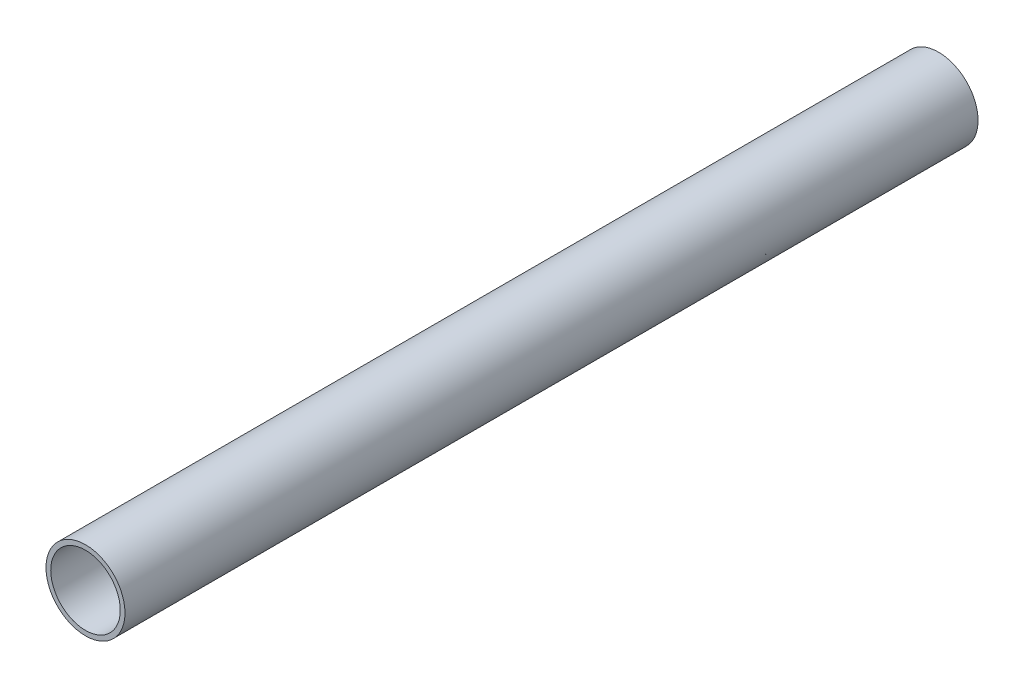
ISO-10303-21;
HEADER;
FILE_DESCRIPTION(('STEP AP214'),'2;1');
FILE_NAME('part.step','',(''),(''),'','','');
FILE_SCHEMA(('AUTOMOTIVE_DESIGN { 1 0 10303 214 1 1 1 1 }'));
ENDSEC;
DATA;
#1=APPLICATION_CONTEXT('core data for automotive mechanical design processes');
#2=APPLICATION_PROTOCOL_DEFINITION('international standard','automotive_design',2000,#1);
#3=PRODUCT_CONTEXT('',#1,'mechanical');
#4=PRODUCT('Part','Part','',(#3));
#5=PRODUCT_RELATED_PRODUCT_CATEGORY('part','',(#4));
#6=PRODUCT_DEFINITION_FORMATION('','',#4);
#7=PRODUCT_DEFINITION_CONTEXT('part definition',#1,'design');
#8=PRODUCT_DEFINITION('design','',#6,#7);
#9=PRODUCT_DEFINITION_SHAPE('','',#8);
#10=(LENGTH_UNIT() NAMED_UNIT(*) SI_UNIT(.MILLI.,.METRE.));
#11=(NAMED_UNIT(*) PLANE_ANGLE_UNIT() SI_UNIT($,.RADIAN.));
#12=(NAMED_UNIT(*) SI_UNIT($,.STERADIAN.) SOLID_ANGLE_UNIT());
#13=UNCERTAINTY_MEASURE_WITH_UNIT(LENGTH_MEASURE(1.E-05),#10,'distance_accuracy_value','');
#14=(GEOMETRIC_REPRESENTATION_CONTEXT(3) GLOBAL_UNCERTAINTY_ASSIGNED_CONTEXT((#13)) GLOBAL_UNIT_ASSIGNED_CONTEXT((#10,
#11,#12)) REPRESENTATION_CONTEXT('',''));
#15=CARTESIAN_POINT('',(0.,0.,0.));
#16=DIRECTION('',(0.,0.,1.));
#17=DIRECTION('',(1.,0.,0.));
#18=AXIS2_PLACEMENT_3D('',#15,#16,#17);
#19=CARTESIAN_POINT('',(0.,0.,235.43));
#20=DIRECTION('',(0.,0.,-1.));
#21=DIRECTION('',(-1.,0.,0.));
#22=AXIS2_PLACEMENT_3D('',#19,#20,#21);
#23=CYLINDRICAL_SURFACE('',#22,12.5);
#24=CARTESIAN_POINT('',(0.,0.,-19.57));
#25=DIRECTION('',(0.,0.,-1.));
#26=DIRECTION('',(-1.,0.,0.));
#27=AXIS2_PLACEMENT_3D('',#24,#25,#26);
#28=CIRCLE('',#27,12.5);
#29=CARTESIAN_POINT('',(-12.5,0.,-19.57));
#30=VERTEX_POINT('',#29);
#31=EDGE_CURVE('E10',#30,#30,#28,.T.);
#32=ORIENTED_EDGE('',*,*,#31,.F.);
#33=EDGE_LOOP('',(#32));
#34=FACE_BOUND('',#33,.T.);
#35=CARTESIAN_POINT('',(0.,0.,250.43));
#36=DIRECTION('',(0.,0.,1.));
#37=DIRECTION('',(1.,0.,0.));
#38=AXIS2_PLACEMENT_3D('',#35,#36,#37);
#39=CIRCLE('',#38,12.5);
#40=CARTESIAN_POINT('',(12.5,0.,250.43));
#41=VERTEX_POINT('',#40);
#42=EDGE_CURVE('E50',#41,#41,#39,.T.);
#43=ORIENTED_EDGE('',*,*,#42,.F.);
#44=EDGE_LOOP('',(#43));
#45=FACE_BOUND('',#44,.T.);
#46=ADVANCED_FACE('F42',(#34,#45),#23,.T.);
#47=CARTESIAN_POINT('',(1.22546035237292,2.32941642090623,-19.57));
#48=DIRECTION('',(0.,0.,-1.));
#49=DIRECTION('',(-1.,0.,0.));
#50=AXIS2_PLACEMENT_3D('',#47,#48,#49);
#51=PLANE('',#50);
#52=CARTESIAN_POINT('',(0.,0.,-19.57));
#53=DIRECTION('',(0.,0.,-1.));
#54=DIRECTION('',(-1.,0.,0.));
#55=AXIS2_PLACEMENT_3D('',#52,#53,#54);
#56=CIRCLE('',#55,11.);
#57=CARTESIAN_POINT('',(-11.,0.,-19.57));
#58=VERTEX_POINT('',#57);
#59=EDGE_CURVE('E58',#58,#58,#56,.T.);
#60=ORIENTED_EDGE('',*,*,#59,.F.);
#61=EDGE_LOOP('',(#60));
#62=FACE_BOUND('',#61,.T.);
#63=ORIENTED_EDGE('',*,*,#31,.T.);
#64=EDGE_LOOP('',(#63));
#65=FACE_BOUND('',#64,.T.);
#66=ADVANCED_FACE('F71',(#62,#65),#51,.T.);
#67=CARTESIAN_POINT('',(0.,0.,250.43));
#68=DIRECTION('',(0.,0.,1.));
#69=DIRECTION('',(1.,0.,0.));
#70=AXIS2_PLACEMENT_3D('',#67,#68,#69);
#71=PLANE('',#70);
#72=CARTESIAN_POINT('',(0.,0.,250.43));
#73=DIRECTION('',(0.,0.,1.));
#74=DIRECTION('',(1.,0.,0.));
#75=AXIS2_PLACEMENT_3D('',#72,#73,#74);
#76=CIRCLE('',#75,11.);
#77=CARTESIAN_POINT('',(11.,0.,250.43));
#78=VERTEX_POINT('',#77);
#79=EDGE_CURVE('E45',#78,#78,#76,.T.);
#80=ORIENTED_EDGE('',*,*,#79,.F.);
#81=EDGE_LOOP('',(#80));
#82=FACE_BOUND('',#81,.T.);
#83=ORIENTED_EDGE('',*,*,#42,.T.);
#84=EDGE_LOOP('',(#83));
#85=FACE_BOUND('',#84,.T.);
#86=ADVANCED_FACE('F68',(#82,#85),#71,.T.);
#87=CARTESIAN_POINT('',(0.,0.,300.43));
#88=DIRECTION('',(0.,0.,-1.));
#89=DIRECTION('',(-1.,0.,0.));
#90=AXIS2_PLACEMENT_3D('',#87,#88,#89);
#91=CYLINDRICAL_SURFACE('',#90,11.);
#92=ORIENTED_EDGE('',*,*,#79,.T.);
#93=EDGE_LOOP('',(#92));
#94=FACE_BOUND('',#93,.T.);
#95=ORIENTED_EDGE('',*,*,#59,.T.);
#96=EDGE_LOOP('',(#95));
#97=FACE_BOUND('',#96,.T.);
#98=ADVANCED_FACE('F66',(#94,#97),#91,.F.);
#99=CLOSED_SHELL('',(#46,#66,#86,#98));
#100=MANIFOLD_SOLID_BREP('B2',#99);
#101=ADVANCED_BREP_SHAPE_REPRESENTATION('',(#18,#100),#14);
#102=SHAPE_DEFINITION_REPRESENTATION(#9,#101);
ENDSEC;
END-ISO-10303-21;
